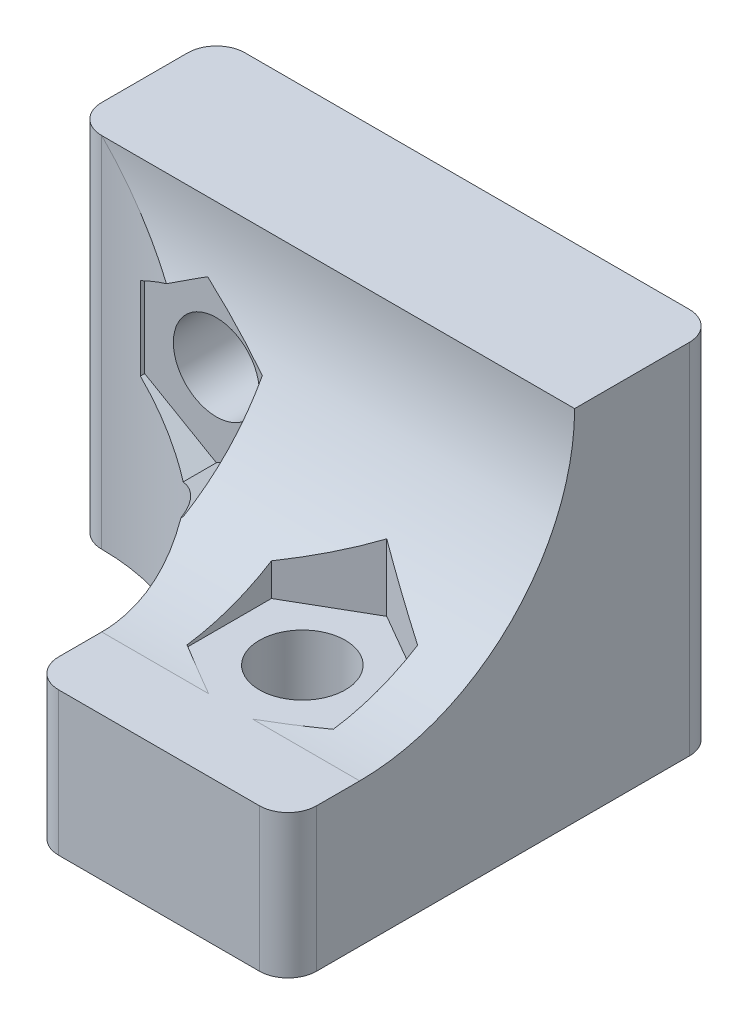
ISO-10303-21;
HEADER;
FILE_DESCRIPTION(('STEP AP214'),'2;1');
FILE_NAME('part.step','',(''),(''),'','','');
FILE_SCHEMA(('AUTOMOTIVE_DESIGN { 1 0 10303 214 1 1 1 1 }'));
ENDSEC;
DATA;
#1=APPLICATION_CONTEXT('core data for automotive mechanical design processes');
#2=APPLICATION_PROTOCOL_DEFINITION('international standard','automotive_design',2000,#1);
#3=PRODUCT_CONTEXT('',#1,'mechanical');
#4=PRODUCT('Part','Part','',(#3));
#5=PRODUCT_RELATED_PRODUCT_CATEGORY('part','',(#4));
#6=PRODUCT_DEFINITION_FORMATION('','',#4);
#7=PRODUCT_DEFINITION_CONTEXT('part definition',#1,'design');
#8=PRODUCT_DEFINITION('design','',#6,#7);
#9=PRODUCT_DEFINITION_SHAPE('','',#8);
#10=(LENGTH_UNIT() NAMED_UNIT(*) SI_UNIT(.MILLI.,.METRE.));
#11=(NAMED_UNIT(*) PLANE_ANGLE_UNIT() SI_UNIT($,.RADIAN.));
#12=(NAMED_UNIT(*) SI_UNIT($,.STERADIAN.) SOLID_ANGLE_UNIT());
#13=UNCERTAINTY_MEASURE_WITH_UNIT(LENGTH_MEASURE(1.E-05),#10,'distance_accuracy_value','');
#14=(GEOMETRIC_REPRESENTATION_CONTEXT(3) GLOBAL_UNCERTAINTY_ASSIGNED_CONTEXT((#13)) GLOBAL_UNIT_ASSIGNED_CONTEXT((#10,
#11,#12)) REPRESENTATION_CONTEXT('',''));
#15=CARTESIAN_POINT('',(0.,0.,0.));
#16=DIRECTION('',(0.,0.,1.));
#17=DIRECTION('',(1.,0.,0.));
#18=AXIS2_PLACEMENT_3D('',#15,#16,#17);
#19=CARTESIAN_POINT('',(17.5,12.5,10.));
#20=DIRECTION('',(-1.,0.,0.));
#21=DIRECTION('',(0.,0.,1.));
#22=AXIS2_PLACEMENT_3D('',#19,#20,#21);
#23=PLANE('',#22);
#24=DIRECTION('',(0.,0.,-1.));
#25=VECTOR('',#24,1.);
#26=CARTESIAN_POINT('',(17.5,-12.5,10.));
#27=LINE('',#26,#25);
#28=CARTESIAN_POINT('',(17.5,-12.5,28.));
#29=VERTEX_POINT('',#28);
#30=CARTESIAN_POINT('',(17.5,-12.5,2.));
#31=VERTEX_POINT('',#30);
#32=EDGE_CURVE('E384',#29,#31,#27,.T.);
#33=ORIENTED_EDGE('',*,*,#32,.T.);
#34=DIRECTION('',(0.,1.,0.));
#35=VECTOR('',#34,1.);
#36=CARTESIAN_POINT('',(17.5,12.5,2.));
#37=LINE('',#36,#35);
#38=CARTESIAN_POINT('',(17.5,12.5,2.));
#39=VERTEX_POINT('',#38);
#40=EDGE_CURVE('E435',#31,#39,#37,.T.);
#41=ORIENTED_EDGE('',*,*,#40,.T.);
#42=DIRECTION('',(0.,0.,-1.));
#43=VECTOR('',#42,1.);
#44=CARTESIAN_POINT('',(17.5,12.5,10.));
#45=LINE('',#44,#43);
#46=CARTESIAN_POINT('',(17.5,12.5,10.));
#47=VERTEX_POINT('',#46);
#48=EDGE_CURVE('E403',#47,#39,#45,.T.);
#49=ORIENTED_EDGE('',*,*,#48,.F.);
#50=CARTESIAN_POINT('',(17.5,12.5,25.));
#51=DIRECTION('',(-1.,0.,0.));
#52=DIRECTION('',(0.,0.,1.));
#53=AXIS2_PLACEMENT_3D('',#50,#51,#52);
#54=CIRCLE('',#53,15.);
#55=CARTESIAN_POINT('',(17.5,-2.5,25.));
#56=VERTEX_POINT('',#55);
#57=EDGE_CURVE('E424',#47,#56,#54,.T.);
#58=ORIENTED_EDGE('',*,*,#57,.T.);
#59=DIRECTION('',(0.,0.,-1.));
#60=VECTOR('',#59,1.);
#61=CARTESIAN_POINT('',(17.5,-2.5,30.));
#62=LINE('',#61,#60);
#63=CARTESIAN_POINT('',(17.5,-2.5,28.));
#64=VERTEX_POINT('',#63);
#65=EDGE_CURVE('E372',#64,#56,#62,.T.);
#66=ORIENTED_EDGE('',*,*,#65,.F.);
#67=DIRECTION('',(0.,1.,0.));
#68=VECTOR('',#67,1.);
#69=CARTESIAN_POINT('',(17.5,-12.5,28.));
#70=LINE('',#69,#68);
#71=EDGE_CURVE('E428',#64,#29,#70,.F.);
#72=ORIENTED_EDGE('',*,*,#71,.T.);
#73=EDGE_LOOP('',(#33,#41,#49,#58,#66,#72));
#74=FACE_BOUND('',#73,.T.);
#75=ADVANCED_FACE('F80',(#74),#23,.F.);
#76=CARTESIAN_POINT('',(-17.5,12.5,10.));
#77=DIRECTION('',(0.,-1.,0.));
#78=DIRECTION('',(0.,0.,-1.));
#79=AXIS2_PLACEMENT_3D('',#76,#77,#78);
#80=PLANE('',#79);
#81=ORIENTED_EDGE('',*,*,#48,.T.);
#82=CARTESIAN_POINT('',(15.5,12.5,2.));
#83=DIRECTION('',(0.,-1.,0.));
#84=DIRECTION('',(0.,0.,-1.));
#85=AXIS2_PLACEMENT_3D('',#82,#83,#84);
#86=CIRCLE('',#85,2.);
#87=CARTESIAN_POINT('',(15.5,12.5,0.));
#88=VERTEX_POINT('',#87);
#89=EDGE_CURVE('E446',#39,#88,#86,.F.);
#90=ORIENTED_EDGE('',*,*,#89,.T.);
#91=DIRECTION('',(-1.,0.,0.));
#92=VECTOR('',#91,1.);
#93=CARTESIAN_POINT('',(-17.5,12.5,0.));
#94=LINE('',#93,#92);
#95=CARTESIAN_POINT('',(-15.5,12.5,0.));
#96=VERTEX_POINT('',#95);
#97=EDGE_CURVE('E379',#88,#96,#94,.T.);
#98=ORIENTED_EDGE('',*,*,#97,.T.);
#99=CARTESIAN_POINT('',(-15.5,12.5,2.));
#100=DIRECTION('',(0.,-1.,0.));
#101=DIRECTION('',(0.,0.,-1.));
#102=AXIS2_PLACEMENT_3D('',#99,#100,#101);
#103=CIRCLE('',#102,2.);
#104=CARTESIAN_POINT('',(-17.5,12.5,2.));
#105=VERTEX_POINT('',#104);
#106=EDGE_CURVE('E443',#96,#105,#103,.F.);
#107=ORIENTED_EDGE('',*,*,#106,.T.);
#108=DIRECTION('',(0.,0.,-1.));
#109=VECTOR('',#108,1.);
#110=CARTESIAN_POINT('',(-17.5,12.5,10.));
#111=LINE('',#110,#109);
#112=CARTESIAN_POINT('',(-17.5,12.5,8.));
#113=VERTEX_POINT('',#112);
#114=EDGE_CURVE('E399',#113,#105,#111,.T.);
#115=ORIENTED_EDGE('',*,*,#114,.F.);
#116=CARTESIAN_POINT('',(-15.5,12.5,8.));
#117=DIRECTION('',(0.,-1.,0.));
#118=DIRECTION('',(0.,0.,-1.));
#119=AXIS2_PLACEMENT_3D('',#116,#117,#118);
#120=CIRCLE('',#119,2.);
#121=CARTESIAN_POINT('',(-15.5,12.5,10.));
#122=VERTEX_POINT('',#121);
#123=EDGE_CURVE('E439',#113,#122,#120,.F.);
#124=ORIENTED_EDGE('',*,*,#123,.T.);
#125=DIRECTION('',(-1.,0.,0.));
#126=VECTOR('',#125,1.);
#127=CARTESIAN_POINT('',(-17.5,12.5,10.));
#128=LINE('',#127,#126);
#129=EDGE_CURVE('E380',#47,#122,#128,.T.);
#130=ORIENTED_EDGE('',*,*,#129,.F.);
#131=EDGE_LOOP('',(#81,#90,#98,#107,#115,#124,#130));
#132=FACE_BOUND('',#131,.T.);
#133=ADVANCED_FACE('F556',(#132),#80,.F.);
#134=CARTESIAN_POINT('',(-17.5,12.5,10.));
#135=DIRECTION('',(1.,0.,0.));
#136=DIRECTION('',(0.,1.,0.));
#137=AXIS2_PLACEMENT_3D('',#134,#135,#136);
#138=PLANE('',#137);
#139=ORIENTED_EDGE('',*,*,#114,.T.);
#140=DIRECTION('',(0.,-1.,0.));
#141=VECTOR('',#140,1.);
#142=CARTESIAN_POINT('',(-17.5,12.5,2.));
#143=LINE('',#142,#141);
#144=CARTESIAN_POINT('',(-17.5,-12.5,2.));
#145=VERTEX_POINT('',#144);
#146=EDGE_CURVE('E473',#105,#145,#143,.T.);
#147=ORIENTED_EDGE('',*,*,#146,.T.);
#148=DIRECTION('',(0.,0.,-1.));
#149=VECTOR('',#148,1.);
#150=CARTESIAN_POINT('',(-17.5,-12.5,10.));
#151=LINE('',#150,#149);
#152=CARTESIAN_POINT('',(-17.5,-12.5,8.));
#153=VERTEX_POINT('',#152);
#154=EDGE_CURVE('E395',#153,#145,#151,.T.);
#155=ORIENTED_EDGE('',*,*,#154,.F.);
#156=DIRECTION('',(0.,-1.,0.));
#157=VECTOR('',#156,1.);
#158=CARTESIAN_POINT('',(-17.5,12.5,8.));
#159=LINE('',#158,#157);
#160=EDGE_CURVE('E470',#153,#113,#159,.F.);
#161=ORIENTED_EDGE('',*,*,#160,.T.);
#162=EDGE_LOOP('',(#139,#147,#155,#161));
#163=FACE_BOUND('',#162,.T.);
#164=ADVANCED_FACE('F603',(#163),#138,.F.);
#165=CARTESIAN_POINT('',(-17.5,-12.5,10.));
#166=DIRECTION('',(0.,1.,0.));
#167=DIRECTION('',(0.,0.,1.));
#168=AXIS2_PLACEMENT_3D('',#165,#166,#167);
#169=PLANE('',#168);
#170=CARTESIAN_POINT('',(8.50000000000001,-12.5,20.));
#171=DIRECTION('',(0.,1.,0.));
#172=DIRECTION('',(-1.,0.,0.));
#173=AXIS2_PLACEMENT_3D('',#170,#171,#172);
#174=CIRCLE('',#173,3.);
#175=CARTESIAN_POINT('',(5.50000000000001,-12.5,20.));
#176=VERTEX_POINT('',#175);
#177=EDGE_CURVE('E352',#176,#176,#174,.T.);
#178=ORIENTED_EDGE('',*,*,#177,.T.);
#179=EDGE_LOOP('',(#178));
#180=FACE_BOUND('',#179,.T.);
#181=DIRECTION('',(1.,0.,0.));
#182=VECTOR('',#181,1.);
#183=CARTESIAN_POINT('',(-17.5,-12.5,0.));
#184=LINE('',#183,#182);
#185=CARTESIAN_POINT('',(-15.5,-12.5,0.));
#186=VERTEX_POINT('',#185);
#187=CARTESIAN_POINT('',(15.5,-12.5,0.));
#188=VERTEX_POINT('',#187);
#189=EDGE_CURVE('E385',#186,#188,#184,.T.);
#190=ORIENTED_EDGE('',*,*,#189,.T.);
#191=CARTESIAN_POINT('',(15.5,-12.5,2.));
#192=DIRECTION('',(0.,1.,0.));
#193=DIRECTION('',(0.,0.,1.));
#194=AXIS2_PLACEMENT_3D('',#191,#192,#193);
#195=CIRCLE('',#194,2.);
#196=EDGE_CURVE('E467',#188,#31,#195,.F.);
#197=ORIENTED_EDGE('',*,*,#196,.T.);
#198=ORIENTED_EDGE('',*,*,#32,.F.);
#199=CARTESIAN_POINT('',(15.5,-12.5,28.));
#200=DIRECTION('',(0.,1.,0.));
#201=DIRECTION('',(0.,0.,1.));
#202=AXIS2_PLACEMENT_3D('',#199,#200,#201);
#203=CIRCLE('',#202,2.);
#204=CARTESIAN_POINT('',(15.5,-12.5,30.));
#205=VERTEX_POINT('',#204);
#206=EDGE_CURVE('E455',#29,#205,#203,.F.);
#207=ORIENTED_EDGE('',*,*,#206,.T.);
#208=DIRECTION('',(1.,0.,0.));
#209=VECTOR('',#208,1.);
#210=CARTESIAN_POINT('',(17.5,-12.5,30.));
#211=LINE('',#210,#209);
#212=CARTESIAN_POINT('',(1.5,-12.5,30.));
#213=VERTEX_POINT('',#212);
#214=EDGE_CURVE('E361',#213,#205,#211,.T.);
#215=ORIENTED_EDGE('',*,*,#214,.F.);
#216=CARTESIAN_POINT('',(1.5,-12.5,28.));
#217=DIRECTION('',(0.,1.,0.));
#218=DIRECTION('',(0.,0.,1.));
#219=AXIS2_PLACEMENT_3D('',#216,#217,#218);
#220=CIRCLE('',#219,2.);
#221=CARTESIAN_POINT('',(-0.499999999999997,-12.5,28.));
#222=VERTEX_POINT('',#221);
#223=EDGE_CURVE('E458',#213,#222,#220,.F.);
#224=ORIENTED_EDGE('',*,*,#223,.T.);
#225=DIRECTION('',(0.,0.,-1.));
#226=VECTOR('',#225,1.);
#227=CARTESIAN_POINT('',(-0.499999999999997,-12.5,30.));
#228=LINE('',#227,#226);
#229=CARTESIAN_POINT('',(-0.499999999999997,-12.5,25.));
#230=VERTEX_POINT('',#229);
#231=EDGE_CURVE('E365',#222,#230,#228,.T.);
#232=ORIENTED_EDGE('',*,*,#231,.T.);
#233=CARTESIAN_POINT('',(-15.5,-12.5,25.));
#234=DIRECTION('',(0.,1.,0.));
#235=DIRECTION('',(0.,0.,1.));
#236=AXIS2_PLACEMENT_3D('',#233,#234,#235);
#237=CIRCLE('',#236,15.);
#238=CARTESIAN_POINT('',(-15.5,-12.5,10.));
#239=VERTEX_POINT('',#238);
#240=EDGE_CURVE('E420',#230,#239,#237,.T.);
#241=ORIENTED_EDGE('',*,*,#240,.T.);
#242=CARTESIAN_POINT('',(-15.5,-12.5,8.));
#243=DIRECTION('',(0.,1.,0.));
#244=DIRECTION('',(0.,0.,1.));
#245=AXIS2_PLACEMENT_3D('',#242,#243,#244);
#246=CIRCLE('',#245,2.);
#247=EDGE_CURVE('E461',#239,#153,#246,.F.);
#248=ORIENTED_EDGE('',*,*,#247,.T.);
#249=ORIENTED_EDGE('',*,*,#154,.T.);
#250=CARTESIAN_POINT('',(-15.5,-12.5,2.));
#251=DIRECTION('',(0.,1.,0.));
#252=DIRECTION('',(0.,0.,1.));
#253=AXIS2_PLACEMENT_3D('',#250,#251,#252);
#254=CIRCLE('',#253,2.);
#255=EDGE_CURVE('E464',#145,#186,#254,.F.);
#256=ORIENTED_EDGE('',*,*,#255,.T.);
#257=EDGE_LOOP('',(#190,#197,#198,#207,#215,#224,#232,#241,#248,#249,#256));
#258=FACE_BOUND('',#257,.T.);
#259=ADVANCED_FACE('F565',(#180,#258),#169,.F.);
#260=CARTESIAN_POINT('',(0.,0.,0.));
#261=DIRECTION('',(0.,0.,1.));
#262=DIRECTION('',(1.,0.,0.));
#263=AXIS2_PLACEMENT_3D('',#260,#261,#262);
#264=PLANE('',#263);
#265=CARTESIAN_POINT('',(-7.5,2.5,0.));
#266=DIRECTION('',(0.,0.,1.));
#267=DIRECTION('',(1.,0.,0.));
#268=AXIS2_PLACEMENT_3D('',#265,#266,#267);
#269=CIRCLE('',#268,3.);
#270=CARTESIAN_POINT('',(-4.5,2.5,0.));
#271=VERTEX_POINT('',#270);
#272=EDGE_CURVE('E375',#271,#271,#269,.T.);
#273=ORIENTED_EDGE('',*,*,#272,.T.);
#274=EDGE_LOOP('',(#273));
#275=FACE_BOUND('',#274,.T.);
#276=ORIENTED_EDGE('',*,*,#97,.F.);
#277=DIRECTION('',(0.,1.,0.));
#278=VECTOR('',#277,1.);
#279=CARTESIAN_POINT('',(15.5,0.,0.));
#280=LINE('',#279,#278);
#281=EDGE_CURVE('E452',#88,#188,#280,.F.);
#282=ORIENTED_EDGE('',*,*,#281,.T.);
#283=ORIENTED_EDGE('',*,*,#189,.F.);
#284=DIRECTION('',(0.,-1.,0.));
#285=VECTOR('',#284,1.);
#286=CARTESIAN_POINT('',(-15.5,0.,0.));
#287=LINE('',#286,#285);
#288=EDGE_CURVE('E449',#186,#96,#287,.F.);
#289=ORIENTED_EDGE('',*,*,#288,.T.);
#290=EDGE_LOOP('',(#276,#282,#283,#289));
#291=FACE_BOUND('',#290,.T.);
#292=ADVANCED_FACE('F673',(#275,#291),#264,.F.);
#293=CARTESIAN_POINT('',(-7.5,2.5,0.));
#294=DIRECTION('',(0.,0.,1.));
#295=DIRECTION('',(1.,0.,0.));
#296=AXIS2_PLACEMENT_3D('',#293,#294,#295);
#297=CYLINDRICAL_SURFACE('',#296,3.);
#298=CARTESIAN_POINT('',(-7.5,2.5,10.));
#299=DIRECTION('',(0.,0.,-1.));
#300=DIRECTION('',(-1.,0.,0.));
#301=AXIS2_PLACEMENT_3D('',#298,#299,#300);
#302=CIRCLE('',#301,3.);
#303=CARTESIAN_POINT('',(-10.5,2.5,10.));
#304=VERTEX_POINT('',#303);
#305=EDGE_CURVE('E351',#304,#304,#302,.F.);
#306=ORIENTED_EDGE('',*,*,#305,.T.);
#307=EDGE_LOOP('',(#306));
#308=FACE_BOUND('',#307,.T.);
#309=ORIENTED_EDGE('',*,*,#272,.F.);
#310=EDGE_LOOP('',(#309));
#311=FACE_BOUND('',#310,.T.);
#312=ADVANCED_FACE('F671',(#308,#311),#297,.F.);
#313=CARTESIAN_POINT('',(17.5,-2.5,30.));
#314=DIRECTION('',(0.,-1.,0.));
#315=DIRECTION('',(1.,0.,0.));
#316=AXIS2_PLACEMENT_3D('',#313,#314,#315);
#317=PLANE('',#316);
#318=DIRECTION('',(-0.866025403784439,0.,-0.5));
#319=VECTOR('',#318,1.);
#320=CARTESIAN_POINT('',(8.50000000000001,-2.5,25.8889727457342));
#321=LINE('',#320,#319);
#322=CARTESIAN_POINT('',(6.96025403784431,-2.5,25.));
#323=VERTEX_POINT('',#322);
#324=CARTESIAN_POINT('',(3.39999999999996,-2.5,22.9444863728671));
#325=VERTEX_POINT('',#324);
#326=EDGE_CURVE('E96',#323,#325,#321,.T.);
#327=ORIENTED_EDGE('',*,*,#326,.F.);
#328=DIRECTION('',(-1.,0.,0.));
#329=VECTOR('',#328,1.);
#330=CARTESIAN_POINT('',(17.5,-2.5,25.));
#331=LINE('',#330,#329);
#332=CARTESIAN_POINT('',(-0.499999999999997,-2.5,25.));
#333=VERTEX_POINT('',#332);
#334=EDGE_CURVE('E415',#323,#333,#331,.T.);
#335=ORIENTED_EDGE('',*,*,#334,.T.);
#336=DIRECTION('',(0.,0.,-1.));
#337=VECTOR('',#336,1.);
#338=CARTESIAN_POINT('',(-0.499999999999997,-2.5,30.));
#339=LINE('',#338,#337);
#340=CARTESIAN_POINT('',(-0.499999999999997,-2.5,28.));
#341=VERTEX_POINT('',#340);
#342=EDGE_CURVE('E368',#341,#333,#339,.T.);
#343=ORIENTED_EDGE('',*,*,#342,.F.);
#344=CARTESIAN_POINT('',(1.5,-2.5,28.));
#345=DIRECTION('',(0.,-1.,0.));
#346=DIRECTION('',(1.,0.,0.));
#347=AXIS2_PLACEMENT_3D('',#344,#345,#346);
#348=CIRCLE('',#347,2.);
#349=CARTESIAN_POINT('',(1.5,-2.5,30.));
#350=VERTEX_POINT('',#349);
#351=EDGE_CURVE('E491',#341,#350,#348,.F.);
#352=ORIENTED_EDGE('',*,*,#351,.T.);
#353=DIRECTION('',(-1.,0.,0.));
#354=VECTOR('',#353,1.);
#355=CARTESIAN_POINT('',(17.5,-2.5,30.));
#356=LINE('',#355,#354);
#357=CARTESIAN_POINT('',(15.5,-2.5,30.));
#358=VERTEX_POINT('',#357);
#359=EDGE_CURVE('E356',#358,#350,#356,.T.);
#360=ORIENTED_EDGE('',*,*,#359,.F.);
#361=CARTESIAN_POINT('',(15.5,-2.5,28.));
#362=DIRECTION('',(0.,-1.,0.));
#363=DIRECTION('',(1.,0.,0.));
#364=AXIS2_PLACEMENT_3D('',#361,#362,#363);
#365=CIRCLE('',#364,2.);
#366=EDGE_CURVE('E488',#358,#64,#365,.F.);
#367=ORIENTED_EDGE('',*,*,#366,.T.);
#368=ORIENTED_EDGE('',*,*,#65,.T.);
#369=CARTESIAN_POINT('',(10.0397459621557,-2.5,25.));
#370=VERTEX_POINT('',#369);
#371=EDGE_CURVE('E416',#56,#370,#331,.T.);
#372=ORIENTED_EDGE('',*,*,#371,.T.);
#373=DIRECTION('',(-0.866025403784439,0.,0.5));
#374=VECTOR('',#373,1.);
#375=CARTESIAN_POINT('',(13.6000000000001,-2.5,22.9444863728671));
#376=LINE('',#375,#374);
#377=CARTESIAN_POINT('',(13.6000000000001,-2.5,22.9444863728671));
#378=VERTEX_POINT('',#377);
#379=EDGE_CURVE('E282',#378,#370,#376,.T.);
#380=ORIENTED_EDGE('',*,*,#379,.F.);
#381=DIRECTION('',(0.,0.,1.));
#382=VECTOR('',#381,1.);
#383=CARTESIAN_POINT('',(13.6000000000001,-2.5,17.0555136271329));
#384=LINE('',#383,#382);
#385=CARTESIAN_POINT('',(13.6000000000001,-2.5,17.0555136271329));
#386=VERTEX_POINT('',#385);
#387=EDGE_CURVE('E271',#386,#378,#384,.T.);
#388=ORIENTED_EDGE('',*,*,#387,.F.);
#389=DIRECTION('',(0.866025403784439,0.,0.5));
#390=VECTOR('',#389,1.);
#391=CARTESIAN_POINT('',(8.50000000000001,-2.5,14.1110272542658));
#392=LINE('',#391,#390);
#393=CARTESIAN_POINT('',(8.50000000000001,-2.5,14.1110272542658));
#394=VERTEX_POINT('',#393);
#395=EDGE_CURVE('E253',#394,#386,#392,.T.);
#396=ORIENTED_EDGE('',*,*,#395,.F.);
#397=DIRECTION('',(0.866025403784439,0.,-0.5));
#398=VECTOR('',#397,1.);
#399=CARTESIAN_POINT('',(3.39999999999996,-2.5,17.0555136271329));
#400=LINE('',#399,#398);
#401=CARTESIAN_POINT('',(3.39999999999996,-2.5,17.0555136271329));
#402=VERTEX_POINT('',#401);
#403=EDGE_CURVE('E267',#402,#394,#400,.T.);
#404=ORIENTED_EDGE('',*,*,#403,.F.);
#405=DIRECTION('',(0.,0.,-1.));
#406=VECTOR('',#405,1.);
#407=CARTESIAN_POINT('',(3.39999999999996,-2.5,22.9444863728671));
#408=LINE('',#407,#406);
#409=EDGE_CURVE('E261',#325,#402,#408,.T.);
#410=ORIENTED_EDGE('',*,*,#409,.F.);
#411=EDGE_LOOP('',(#327,#335,#343,#352,#360,#367,#368,#372,#380,#388,#396,#404,#410));
#412=FACE_BOUND('',#411,.T.);
#413=CARTESIAN_POINT('',(8.5,-2.5,20.));
#414=DIRECTION('',(0.,-1.,0.));
#415=DIRECTION('',(0.,0.,-1.));
#416=AXIS2_PLACEMENT_3D('',#413,#414,#415);
#417=CIRCLE('',#416,3.);
#418=CARTESIAN_POINT('',(8.5,-2.5,17.));
#419=VERTEX_POINT('',#418);
#420=EDGE_CURVE('E291',#419,#419,#417,.F.);
#421=ORIENTED_EDGE('',*,*,#420,.F.);
#422=EDGE_LOOP('',(#421));
#423=FACE_BOUND('',#422,.T.);
#424=ADVANCED_FACE('F265',(#412,#423),#317,.F.);
#425=CARTESIAN_POINT('',(-0.499999999999997,-12.5,30.));
#426=DIRECTION('',(1.,0.,0.));
#427=DIRECTION('',(0.,0.,-1.));
#428=AXIS2_PLACEMENT_3D('',#425,#426,#427);
#429=PLANE('',#428);
#430=ORIENTED_EDGE('',*,*,#231,.F.);
#431=DIRECTION('',(0.,-1.,0.));
#432=VECTOR('',#431,1.);
#433=CARTESIAN_POINT('',(-0.499999999999997,-2.5,28.));
#434=LINE('',#433,#432);
#435=EDGE_CURVE('E485',#222,#341,#434,.F.);
#436=ORIENTED_EDGE('',*,*,#435,.T.);
#437=ORIENTED_EDGE('',*,*,#342,.T.);
#438=DIRECTION('',(0.,-1.,0.));
#439=VECTOR('',#438,1.);
#440=CARTESIAN_POINT('',(-0.499999999999997,-12.5,25.));
#441=LINE('',#440,#439);
#442=EDGE_CURVE('E407',#333,#230,#441,.T.);
#443=ORIENTED_EDGE('',*,*,#442,.T.);
#444=EDGE_LOOP('',(#430,#436,#437,#443));
#445=FACE_BOUND('',#444,.T.);
#446=ADVANCED_FACE('F568',(#445),#429,.F.);
#447=CARTESIAN_POINT('',(0.,0.,30.));
#448=DIRECTION('',(0.,0.,1.));
#449=DIRECTION('',(1.,0.,0.));
#450=AXIS2_PLACEMENT_3D('',#447,#448,#449);
#451=PLANE('',#450);
#452=ORIENTED_EDGE('',*,*,#359,.T.);
#453=DIRECTION('',(0.,-1.,0.));
#454=VECTOR('',#453,1.);
#455=CARTESIAN_POINT('',(1.5,-12.5,30.));
#456=LINE('',#455,#454);
#457=EDGE_CURVE('E481',#350,#213,#456,.T.);
#458=ORIENTED_EDGE('',*,*,#457,.T.);
#459=ORIENTED_EDGE('',*,*,#214,.T.);
#460=DIRECTION('',(0.,1.,0.));
#461=VECTOR('',#460,1.);
#462=CARTESIAN_POINT('',(15.5,-2.5,30.));
#463=LINE('',#462,#461);
#464=EDGE_CURVE('E477',#205,#358,#463,.T.);
#465=ORIENTED_EDGE('',*,*,#464,.T.);
#466=EDGE_LOOP('',(#452,#458,#459,#465));
#467=FACE_BOUND('',#466,.T.);
#468=ADVANCED_FACE('F577',(#467),#451,.T.);
#469=CARTESIAN_POINT('',(8.50000000000001,-12.5,20.));
#470=DIRECTION('',(0.,1.,0.));
#471=DIRECTION('',(-1.,0.,0.));
#472=AXIS2_PLACEMENT_3D('',#469,#470,#471);
#473=CYLINDRICAL_SURFACE('',#472,3.);
#474=ORIENTED_EDGE('',*,*,#420,.T.);
#475=EDGE_LOOP('',(#474));
#476=FACE_BOUND('',#475,.T.);
#477=ORIENTED_EDGE('',*,*,#177,.F.);
#478=EDGE_LOOP('',(#477));
#479=FACE_BOUND('',#478,.T.);
#480=ADVANCED_FACE('F612',(#476,#479),#473,.F.);
#481=CARTESIAN_POINT('',(17.5,12.5,25.));
#482=DIRECTION('',(-1.,0.,0.));
#483=DIRECTION('',(0.,-1.,0.));
#484=AXIS2_PLACEMENT_3D('',#481,#482,#483);
#485=CYLINDRICAL_SURFACE('',#484,15.);
#486=ORIENTED_EDGE('',*,*,#334,.F.);
#487=CARTESIAN_POINT('',(6.96025403784431,12.5,25.));
#488=DIRECTION('',(-0.5,0.,0.866025403784439));
#489=DIRECTION('',(-0.866025403784439,0.,-0.5));
#490=AXIS2_PLACEMENT_3D('',#487,#488,#489);
#491=ELLIPSE('',#490,30.,15.);
#492=CARTESIAN_POINT('',(3.39999999999996,-2.3584946656339,22.9444863728671));
#493=VERTEX_POINT('',#492);
#494=EDGE_CURVE('E12',#323,#493,#491,.F.);
#495=ORIENTED_EDGE('',*,*,#494,.T.);
#496=CARTESIAN_POINT('',(3.39999999999996,12.5,25.));
#497=DIRECTION('',(-1.,0.,0.));
#498=DIRECTION('',(0.,0.,1.));
#499=AXIS2_PLACEMENT_3D('',#496,#497,#498);
#500=CIRCLE('',#499,15.);
#501=CARTESIAN_POINT('',(3.39999999999996,-0.223408987819607,17.0555136271329));
#502=VERTEX_POINT('',#501);
#503=EDGE_CURVE('E89',#493,#502,#500,.F.);
#504=ORIENTED_EDGE('',*,*,#503,.T.);
#505=CARTESIAN_POINT('',(-10.3602540378445,12.5,25.));
#506=DIRECTION('',(-0.5,0.,-0.866025403784438));
#507=DIRECTION('',(-0.866025403784439,0.,0.5));
#508=AXIS2_PLACEMENT_3D('',#505,#506,#507);
#509=ELLIPSE('',#508,30.,15.);
#510=CARTESIAN_POINT('',(8.50000000000001,2.18349513921226,14.1110272542658));
#511=VERTEX_POINT('',#510);
#512=EDGE_CURVE('E531',#502,#511,#509,.F.);
#513=ORIENTED_EDGE('',*,*,#512,.T.);
#514=CARTESIAN_POINT('',(27.3602540378445,12.5,25.));
#515=DIRECTION('',(0.5,0.,-0.866025403784439));
#516=DIRECTION('',(-0.866025403784439,0.,-0.5));
#517=AXIS2_PLACEMENT_3D('',#514,#515,#516);
#518=ELLIPSE('',#517,30.,15.);
#519=CARTESIAN_POINT('',(13.6000000000001,-0.223408987819603,17.0555136271329));
#520=VERTEX_POINT('',#519);
#521=EDGE_CURVE('E255',#511,#520,#518,.F.);
#522=ORIENTED_EDGE('',*,*,#521,.T.);
#523=CARTESIAN_POINT('',(13.6000000000001,12.5,25.));
#524=DIRECTION('',(1.,0.,0.));
#525=DIRECTION('',(0.,0.,-1.));
#526=AXIS2_PLACEMENT_3D('',#523,#524,#525);
#527=CIRCLE('',#526,15.);
#528=CARTESIAN_POINT('',(13.6000000000001,-2.3584946656339,22.9444863728671));
#529=VERTEX_POINT('',#528);
#530=EDGE_CURVE('E523',#520,#529,#527,.F.);
#531=ORIENTED_EDGE('',*,*,#530,.T.);
#532=CARTESIAN_POINT('',(10.0397459621557,12.5,25.));
#533=DIRECTION('',(0.5,0.,0.866025403784438));
#534=DIRECTION('',(-0.866025403784439,0.,0.5));
#535=AXIS2_PLACEMENT_3D('',#532,#533,#534);
#536=ELLIPSE('',#535,30.,15.);
#537=EDGE_CURVE('E527',#529,#370,#536,.F.);
#538=ORIENTED_EDGE('',*,*,#537,.T.);
#539=ORIENTED_EDGE('',*,*,#371,.F.);
#540=ORIENTED_EDGE('',*,*,#57,.F.);
#541=ORIENTED_EDGE('',*,*,#129,.T.);
#542=CARTESIAN_POINT('',(-15.5,12.5,25.));
#543=DIRECTION('',(-0.707106781186547,-0.707106781186548,0.));
#544=DIRECTION('',(-0.707106781186548,0.707106781186547,0.));
#545=AXIS2_PLACEMENT_3D('',#542,#543,#544);
#546=ELLIPSE('',#545,21.2132034355964,15.);
#547=CARTESIAN_POINT('',(-9.89230484541329,6.89230484541329,11.0876402054423));
#548=VERTEX_POINT('',#547);
#549=EDGE_CURVE('E432',#548,#122,#546,.F.);
#550=ORIENTED_EDGE('',*,*,#549,.F.);
#551=CARTESIAN_POINT('',(-0.179491924311315,12.5,25.));
#552=DIRECTION('',(-0.5,0.866025403784439,0.));
#553=DIRECTION('',(-0.866025403784439,-0.5,0.));
#554=AXIS2_PLACEMENT_3D('',#551,#552,#553);
#555=ELLIPSE('',#554,30.,15.);
#556=CARTESIAN_POINT('',(-7.5,8.27350269189631,10.6077548483709));
#557=VERTEX_POINT('',#556);
#558=EDGE_CURVE('E347',#548,#557,#555,.F.);
#559=ORIENTED_EDGE('',*,*,#558,.T.);
#560=CARTESIAN_POINT('',(-14.8205080756887,12.5,25.));
#561=DIRECTION('',(0.5,0.866025403784438,0.));
#562=DIRECTION('',(-0.866025403784439,0.5,0.));
#563=AXIS2_PLACEMENT_3D('',#560,#561,#562);
#564=ELLIPSE('',#563,30.,15.);
#565=CARTESIAN_POINT('',(-2.49999999999995,5.38675134594815,11.7938766632433));
#566=VERTEX_POINT('',#565);
#567=EDGE_CURVE('E514',#557,#566,#564,.F.);
#568=ORIENTED_EDGE('',*,*,#567,.T.);
#569=CARTESIAN_POINT('',(-2.49999999999995,12.5,25.));
#570=DIRECTION('',(1.,0.,0.));
#571=DIRECTION('',(0.,0.,-1.));
#572=AXIS2_PLACEMENT_3D('',#569,#570,#571);
#573=CIRCLE('',#572,15.);
#574=CARTESIAN_POINT('',(-2.49999999999995,-0.386751345948155,17.3233054152387));
#575=VERTEX_POINT('',#574);
#576=EDGE_CURVE('E510',#566,#575,#573,.F.);
#577=ORIENTED_EDGE('',*,*,#576,.T.);
#578=CARTESIAN_POINT('',(19.8205080756889,12.5,25.));
#579=DIRECTION('',(0.5,-0.866025403784439,0.));
#580=DIRECTION('',(-0.866025403784439,-0.5,0.));
#581=AXIS2_PLACEMENT_3D('',#578,#579,#580);
#582=ELLIPSE('',#581,30.,15.);
#583=CARTESIAN_POINT('',(-2.57179676972446,-0.428203230275543,17.3933212742556));
#584=VERTEX_POINT('',#583);
#585=EDGE_CURVE('E330',#575,#584,#582,.F.);
#586=ORIENTED_EDGE('',*,*,#585,.T.);
#587=EDGE_CURVE('E357',#333,#584,#546,.F.);
#588=ORIENTED_EDGE('',*,*,#587,.F.);
#589=EDGE_LOOP('',(#486,#495,#504,#513,#522,#531,#538,#539,#540,#541,#550,#559,#568,#577,#586,#588));
#590=FACE_BOUND('',#589,.T.);
#591=ADVANCED_FACE('F537',(#590),#485,.F.);
#592=CARTESIAN_POINT('',(-15.5,-12.5,25.));
#593=DIRECTION('',(0.,-1.,0.));
#594=DIRECTION('',(0.,0.,-1.));
#595=AXIS2_PLACEMENT_3D('',#592,#593,#594);
#596=CYLINDRICAL_SURFACE('',#595,15.);
#597=DIRECTION('',(0.,-1.,0.));
#598=VECTOR('',#597,1.);
#599=CARTESIAN_POINT('',(-12.5,-12.5,10.3030615433009));
#600=LINE('',#599,#598);
#601=CARTESIAN_POINT('',(-12.5,-0.386751345948157,10.3030615433009));
#602=VERTEX_POINT('',#601);
#603=CARTESIAN_POINT('',(-12.5,5.38675134594815,10.3030615433009));
#604=VERTEX_POINT('',#603);
#605=EDGE_CURVE('E502',#602,#604,#600,.F.);
#606=ORIENTED_EDGE('',*,*,#605,.T.);
#607=CARTESIAN_POINT('',(-15.5,3.6547005383793,25.));
#608=DIRECTION('',(-0.5,0.866025403784439,0.));
#609=DIRECTION('',(-0.866025403784439,-0.5,0.));
#610=AXIS2_PLACEMENT_3D('',#607,#608,#609);
#611=ELLIPSE('',#610,17.3205080756888,15.);
#612=EDGE_CURVE('E506',#604,#548,#611,.F.);
#613=ORIENTED_EDGE('',*,*,#612,.T.);
#614=ORIENTED_EDGE('',*,*,#549,.T.);
#615=DIRECTION('',(0.,-1.,0.));
#616=VECTOR('',#615,1.);
#617=CARTESIAN_POINT('',(-15.5,0.,10.));
#618=LINE('',#617,#616);
#619=EDGE_CURVE('E411',#239,#122,#618,.F.);
#620=ORIENTED_EDGE('',*,*,#619,.F.);
#621=ORIENTED_EDGE('',*,*,#240,.F.);
#622=ORIENTED_EDGE('',*,*,#442,.F.);
#623=ORIENTED_EDGE('',*,*,#587,.T.);
#624=CARTESIAN_POINT('',(-15.5,-7.89230484541331,25.));
#625=DIRECTION('',(0.5,-0.866025403784439,0.));
#626=DIRECTION('',(-0.866025403784439,-0.5,0.));
#627=AXIS2_PLACEMENT_3D('',#624,#625,#626);
#628=ELLIPSE('',#627,17.3205080756888,15.);
#629=CARTESIAN_POINT('',(-7.5,-3.27350269189631,12.3114224595505));
#630=VERTEX_POINT('',#629);
#631=EDGE_CURVE('E494',#584,#630,#628,.F.);
#632=ORIENTED_EDGE('',*,*,#631,.T.);
#633=CARTESIAN_POINT('',(-15.5,1.3452994616207,25.));
#634=DIRECTION('',(-0.5,-0.866025403784439,0.));
#635=DIRECTION('',(0.866025403784439,-0.5,0.));
#636=AXIS2_PLACEMENT_3D('',#633,#634,#635);
#637=ELLIPSE('',#636,17.3205080756888,15.);
#638=EDGE_CURVE('E498',#630,#602,#637,.F.);
#639=ORIENTED_EDGE('',*,*,#638,.T.);
#640=EDGE_LOOP('',(#606,#613,#614,#620,#621,#622,#623,#632,#639));
#641=FACE_BOUND('',#640,.T.);
#642=ADVANCED_FACE('F551',(#641),#596,.F.);
#643=CARTESIAN_POINT('',(15.5,12.5,2.));
#644=DIRECTION('',(0.,1.,0.));
#645=DIRECTION('',(0.,0.,1.));
#646=AXIS2_PLACEMENT_3D('',#643,#644,#645);
#647=CYLINDRICAL_SURFACE('',#646,2.);
#648=ORIENTED_EDGE('',*,*,#196,.F.);
#649=ORIENTED_EDGE('',*,*,#281,.F.);
#650=ORIENTED_EDGE('',*,*,#89,.F.);
#651=ORIENTED_EDGE('',*,*,#40,.F.);
#652=EDGE_LOOP('',(#648,#649,#650,#651));
#653=FACE_BOUND('',#652,.T.);
#654=ADVANCED_FACE('F609',(#653),#647,.T.);
#655=CARTESIAN_POINT('',(-15.5,12.5,2.));
#656=DIRECTION('',(0.,-1.,0.));
#657=DIRECTION('',(1.,0.,0.));
#658=AXIS2_PLACEMENT_3D('',#655,#656,#657);
#659=CYLINDRICAL_SURFACE('',#658,2.);
#660=ORIENTED_EDGE('',*,*,#106,.F.);
#661=ORIENTED_EDGE('',*,*,#288,.F.);
#662=ORIENTED_EDGE('',*,*,#255,.F.);
#663=ORIENTED_EDGE('',*,*,#146,.F.);
#664=EDGE_LOOP('',(#660,#661,#662,#663));
#665=FACE_BOUND('',#664,.T.);
#666=ADVANCED_FACE('F615',(#665),#659,.T.);
#667=CARTESIAN_POINT('',(-15.5,0.,8.));
#668=DIRECTION('',(0.,1.,0.));
#669=DIRECTION('',(-1.,0.,0.));
#670=AXIS2_PLACEMENT_3D('',#667,#668,#669);
#671=CYLINDRICAL_SURFACE('',#670,2.);
#672=ORIENTED_EDGE('',*,*,#123,.F.);
#673=ORIENTED_EDGE('',*,*,#160,.F.);
#674=ORIENTED_EDGE('',*,*,#247,.F.);
#675=ORIENTED_EDGE('',*,*,#619,.T.);
#676=EDGE_LOOP('',(#672,#673,#674,#675));
#677=FACE_BOUND('',#676,.T.);
#678=ADVANCED_FACE('F562',(#677),#671,.T.);
#679=CARTESIAN_POINT('',(1.5,0.,28.));
#680=DIRECTION('',(0.,1.,0.));
#681=DIRECTION('',(0.,0.,1.));
#682=AXIS2_PLACEMENT_3D('',#679,#680,#681);
#683=CYLINDRICAL_SURFACE('',#682,2.);
#684=ORIENTED_EDGE('',*,*,#351,.F.);
#685=ORIENTED_EDGE('',*,*,#435,.F.);
#686=ORIENTED_EDGE('',*,*,#223,.F.);
#687=ORIENTED_EDGE('',*,*,#457,.F.);
#688=EDGE_LOOP('',(#684,#685,#686,#687));
#689=FACE_BOUND('',#688,.T.);
#690=ADVANCED_FACE('F574',(#689),#683,.T.);
#691=CARTESIAN_POINT('',(15.5,0.,28.));
#692=DIRECTION('',(0.,-1.,0.));
#693=DIRECTION('',(0.,0.,-1.));
#694=AXIS2_PLACEMENT_3D('',#691,#692,#693);
#695=CYLINDRICAL_SURFACE('',#694,2.);
#696=ORIENTED_EDGE('',*,*,#206,.F.);
#697=ORIENTED_EDGE('',*,*,#71,.F.);
#698=ORIENTED_EDGE('',*,*,#366,.F.);
#699=ORIENTED_EDGE('',*,*,#464,.F.);
#700=EDGE_LOOP('',(#696,#697,#698,#699));
#701=FACE_BOUND('',#700,.T.);
#702=ADVANCED_FACE('F82',(#701),#695,.T.);
#703=CARTESIAN_POINT('',(0.,0.,10.));
#704=DIRECTION('',(0.,0.,-1.));
#705=DIRECTION('',(-1.,0.,0.));
#706=AXIS2_PLACEMENT_3D('',#703,#704,#705);
#707=PLANE('',#706);
#708=DIRECTION('',(0.,-1.,0.));
#709=VECTOR('',#708,1.);
#710=CARTESIAN_POINT('',(-2.49999999999995,0.,10.));
#711=LINE('',#710,#709);
#712=CARTESIAN_POINT('',(-2.49999999999995,5.38675134594815,10.));
#713=VERTEX_POINT('',#712);
#714=CARTESIAN_POINT('',(-2.49999999999995,-0.386751345948155,10.));
#715=VERTEX_POINT('',#714);
#716=EDGE_CURVE('E303',#713,#715,#711,.T.);
#717=ORIENTED_EDGE('',*,*,#716,.F.);
#718=DIRECTION('',(0.866025403784439,-0.5,0.));
#719=VECTOR('',#718,1.);
#720=CARTESIAN_POINT('',(1.70753175473057,2.95753175473058,10.));
#721=LINE('',#720,#719);
#722=CARTESIAN_POINT('',(-7.5,8.27350269189631,10.));
#723=VERTEX_POINT('',#722);
#724=EDGE_CURVE('E322',#723,#713,#721,.T.);
#725=ORIENTED_EDGE('',*,*,#724,.F.);
#726=DIRECTION('',(0.866025403784439,0.5,0.));
#727=VECTOR('',#726,1.);
#728=CARTESIAN_POINT('',(-5.45753175473057,9.45272228311388,10.));
#729=LINE('',#728,#727);
#730=CARTESIAN_POINT('',(-12.5,5.38675134594815,10.));
#731=VERTEX_POINT('',#730);
#732=EDGE_CURVE('E318',#731,#723,#729,.T.);
#733=ORIENTED_EDGE('',*,*,#732,.F.);
#734=DIRECTION('',(0.,1.,0.));
#735=VECTOR('',#734,1.);
#736=CARTESIAN_POINT('',(-12.5,0.,10.));
#737=LINE('',#736,#735);
#738=CARTESIAN_POINT('',(-12.5,-0.386751345948157,10.));
#739=VERTEX_POINT('',#738);
#740=EDGE_CURVE('E314',#739,#731,#737,.T.);
#741=ORIENTED_EDGE('',*,*,#740,.F.);
#742=DIRECTION('',(-0.866025403784439,0.5,0.));
#743=VECTOR('',#742,1.);
#744=CARTESIAN_POINT('',(-3.29246824526947,-5.70272228311388,10.));
#745=LINE('',#744,#743);
#746=CARTESIAN_POINT('',(-7.5,-3.27350269189631,10.));
#747=VERTEX_POINT('',#746);
#748=EDGE_CURVE('E310',#747,#739,#745,.T.);
#749=ORIENTED_EDGE('',*,*,#748,.F.);
#750=DIRECTION('',(-0.866025403784439,-0.5,0.));
#751=VECTOR('',#750,1.);
#752=CARTESIAN_POINT('',(-0.457531754730526,0.792468245269413,10.));
#753=LINE('',#752,#751);
#754=EDGE_CURVE('E307',#715,#747,#753,.T.);
#755=ORIENTED_EDGE('',*,*,#754,.F.);
#756=EDGE_LOOP('',(#717,#725,#733,#741,#749,#755));
#757=FACE_BOUND('',#756,.T.);
#758=ORIENTED_EDGE('',*,*,#305,.F.);
#759=EDGE_LOOP('',(#758));
#760=FACE_BOUND('',#759,.T.);
#761=ADVANCED_FACE('F625',(#757,#760),#707,.F.);
#762=CARTESIAN_POINT('',(1.70753175473057,2.95753175473058,30.));
#763=DIRECTION('',(0.5,0.866025403784438,0.));
#764=DIRECTION('',(-0.866025403784439,0.5,0.));
#765=AXIS2_PLACEMENT_3D('',#762,#763,#764);
#766=PLANE('',#765);
#767=DIRECTION('',(0.,0.,-1.));
#768=VECTOR('',#767,1.);
#769=CARTESIAN_POINT('',(-7.5,8.27350269189631,30.));
#770=LINE('',#769,#768);
#771=EDGE_CURVE('E331',#557,#723,#770,.T.);
#772=ORIENTED_EDGE('',*,*,#771,.T.);
#773=ORIENTED_EDGE('',*,*,#724,.T.);
#774=DIRECTION('',(0.,0.,-1.));
#775=VECTOR('',#774,1.);
#776=CARTESIAN_POINT('',(-2.49999999999995,5.38675134594815,30.));
#777=LINE('',#776,#775);
#778=EDGE_CURVE('E327',#566,#713,#777,.T.);
#779=ORIENTED_EDGE('',*,*,#778,.F.);
#780=ORIENTED_EDGE('',*,*,#567,.F.);
#781=EDGE_LOOP('',(#772,#773,#779,#780));
#782=FACE_BOUND('',#781,.T.);
#783=ADVANCED_FACE('F630',(#782),#766,.F.);
#784=CARTESIAN_POINT('',(-2.49999999999995,0.,30.));
#785=DIRECTION('',(1.,0.,0.));
#786=DIRECTION('',(0.,0.,-1.));
#787=AXIS2_PLACEMENT_3D('',#784,#785,#786);
#788=PLANE('',#787);
#789=ORIENTED_EDGE('',*,*,#778,.T.);
#790=ORIENTED_EDGE('',*,*,#716,.T.);
#791=DIRECTION('',(0.,0.,-1.));
#792=VECTOR('',#791,1.);
#793=CARTESIAN_POINT('',(-2.49999999999995,-0.386751345948155,30.));
#794=LINE('',#793,#792);
#795=EDGE_CURVE('E326',#575,#715,#794,.T.);
#796=ORIENTED_EDGE('',*,*,#795,.F.);
#797=ORIENTED_EDGE('',*,*,#576,.F.);
#798=EDGE_LOOP('',(#789,#790,#796,#797));
#799=FACE_BOUND('',#798,.T.);
#800=ADVANCED_FACE('F636',(#799),#788,.F.);
#801=CARTESIAN_POINT('',(-3.29246824526947,-5.70272228311388,30.));
#802=DIRECTION('',(-0.5,-0.866025403784439,0.));
#803=DIRECTION('',(0.866025403784439,-0.5,0.));
#804=AXIS2_PLACEMENT_3D('',#801,#802,#803);
#805=PLANE('',#804);
#806=DIRECTION('',(0.,0.,-1.));
#807=VECTOR('',#806,1.);
#808=CARTESIAN_POINT('',(-7.5,-3.27350269189631,30.));
#809=LINE('',#808,#807);
#810=EDGE_CURVE('E104',#630,#747,#809,.T.);
#811=ORIENTED_EDGE('',*,*,#810,.T.);
#812=ORIENTED_EDGE('',*,*,#748,.T.);
#813=DIRECTION('',(0.,0.,-1.));
#814=VECTOR('',#813,1.);
#815=CARTESIAN_POINT('',(-12.5,-0.386751345948157,30.));
#816=LINE('',#815,#814);
#817=EDGE_CURVE('E337',#602,#739,#816,.T.);
#818=ORIENTED_EDGE('',*,*,#817,.F.);
#819=ORIENTED_EDGE('',*,*,#638,.F.);
#820=EDGE_LOOP('',(#811,#812,#818,#819));
#821=FACE_BOUND('',#820,.T.);
#822=ADVANCED_FACE('F652',(#821),#805,.F.);
#823=CARTESIAN_POINT('',(-12.5,0.,30.));
#824=DIRECTION('',(-1.,0.,0.));
#825=DIRECTION('',(0.,0.,1.));
#826=AXIS2_PLACEMENT_3D('',#823,#824,#825);
#827=PLANE('',#826);
#828=ORIENTED_EDGE('',*,*,#817,.T.);
#829=ORIENTED_EDGE('',*,*,#740,.T.);
#830=DIRECTION('',(0.,0.,-1.));
#831=VECTOR('',#830,1.);
#832=CARTESIAN_POINT('',(-12.5,5.38675134594815,30.));
#833=LINE('',#832,#831);
#834=EDGE_CURVE('E334',#604,#731,#833,.T.);
#835=ORIENTED_EDGE('',*,*,#834,.F.);
#836=ORIENTED_EDGE('',*,*,#605,.F.);
#837=EDGE_LOOP('',(#828,#829,#835,#836));
#838=FACE_BOUND('',#837,.T.);
#839=ADVANCED_FACE('F648',(#838),#827,.F.);
#840=CARTESIAN_POINT('',(-5.45753175473057,9.45272228311388,30.));
#841=DIRECTION('',(-0.5,0.866025403784439,0.));
#842=DIRECTION('',(-0.866025403784439,-0.5,0.));
#843=AXIS2_PLACEMENT_3D('',#840,#841,#842);
#844=PLANE('',#843);
#845=ORIENTED_EDGE('',*,*,#612,.F.);
#846=ORIENTED_EDGE('',*,*,#834,.T.);
#847=ORIENTED_EDGE('',*,*,#732,.T.);
#848=ORIENTED_EDGE('',*,*,#771,.F.);
#849=ORIENTED_EDGE('',*,*,#558,.F.);
#850=EDGE_LOOP('',(#845,#846,#847,#848,#849));
#851=FACE_BOUND('',#850,.T.);
#852=ADVANCED_FACE('F644',(#851),#844,.F.);
#853=CARTESIAN_POINT('',(-0.457531754730526,0.792468245269413,30.));
#854=DIRECTION('',(0.5,-0.866025403784439,0.));
#855=DIRECTION('',(0.866025403784439,0.5,0.));
#856=AXIS2_PLACEMENT_3D('',#853,#854,#855);
#857=PLANE('',#856);
#858=ORIENTED_EDGE('',*,*,#795,.T.);
#859=ORIENTED_EDGE('',*,*,#754,.T.);
#860=ORIENTED_EDGE('',*,*,#810,.F.);
#861=ORIENTED_EDGE('',*,*,#631,.F.);
#862=ORIENTED_EDGE('',*,*,#585,.F.);
#863=EDGE_LOOP('',(#858,#859,#860,#861,#862));
#864=FACE_BOUND('',#863,.T.);
#865=ADVANCED_FACE('F647',(#864),#857,.F.);
#866=CARTESIAN_POINT('',(3.39999999999996,12.5,17.0555136271329));
#867=DIRECTION('',(-0.5,0.,-0.866025403784438));
#868=DIRECTION('',(-0.866025403784439,0.,0.5));
#869=AXIS2_PLACEMENT_3D('',#866,#867,#868);
#870=PLANE('',#869);
#871=DIRECTION('',(0.,-1.,0.));
#872=VECTOR('',#871,1.);
#873=CARTESIAN_POINT('',(3.39999999999996,12.5,17.0555136271329));
#874=LINE('',#873,#872);
#875=EDGE_CURVE('E276',#502,#402,#874,.T.);
#876=ORIENTED_EDGE('',*,*,#875,.T.);
#877=ORIENTED_EDGE('',*,*,#403,.T.);
#878=DIRECTION('',(0.,-1.,0.));
#879=VECTOR('',#878,1.);
#880=CARTESIAN_POINT('',(8.50000000000001,12.5,14.1110272542658));
#881=LINE('',#880,#879);
#882=EDGE_CURVE('E249',#511,#394,#881,.T.);
#883=ORIENTED_EDGE('',*,*,#882,.F.);
#884=ORIENTED_EDGE('',*,*,#512,.F.);
#885=EDGE_LOOP('',(#876,#877,#883,#884));
#886=FACE_BOUND('',#885,.T.);
#887=ADVANCED_FACE('F274',(#886),#870,.F.);
#888=CARTESIAN_POINT('',(3.39999999999996,12.5,22.9444863728671));
#889=DIRECTION('',(-1.,0.,0.));
#890=DIRECTION('',(0.,0.,1.));
#891=AXIS2_PLACEMENT_3D('',#888,#889,#890);
#892=PLANE('',#891);
#893=DIRECTION('',(0.,-1.,0.));
#894=VECTOR('',#893,1.);
#895=CARTESIAN_POINT('',(3.39999999999996,12.5,22.9444863728671));
#896=LINE('',#895,#894);
#897=EDGE_CURVE('E292',#493,#325,#896,.T.);
#898=ORIENTED_EDGE('',*,*,#897,.T.);
#899=ORIENTED_EDGE('',*,*,#409,.T.);
#900=ORIENTED_EDGE('',*,*,#875,.F.);
#901=ORIENTED_EDGE('',*,*,#503,.F.);
#902=EDGE_LOOP('',(#898,#899,#900,#901));
#903=FACE_BOUND('',#902,.T.);
#904=ADVANCED_FACE('F540',(#903),#892,.F.);
#905=CARTESIAN_POINT('',(8.50000000000001,12.5,25.8889727457342));
#906=DIRECTION('',(-0.5,0.,0.866025403784439));
#907=DIRECTION('',(0.866025403784439,0.,0.5));
#908=AXIS2_PLACEMENT_3D('',#905,#906,#907);
#909=PLANE('',#908);
#910=ORIENTED_EDGE('',*,*,#326,.T.);
#911=ORIENTED_EDGE('',*,*,#897,.F.);
#912=ORIENTED_EDGE('',*,*,#494,.F.);
#913=EDGE_LOOP('',(#910,#911,#912));
#914=FACE_BOUND('',#913,.T.);
#915=ADVANCED_FACE('F542',(#914),#909,.F.);
#916=CARTESIAN_POINT('',(13.6000000000001,12.5,22.9444863728671));
#917=DIRECTION('',(0.5,0.,0.866025403784438));
#918=DIRECTION('',(0.866025403784439,0.,-0.5));
#919=AXIS2_PLACEMENT_3D('',#916,#917,#918);
#920=PLANE('',#919);
#921=DIRECTION('',(0.,-1.,0.));
#922=VECTOR('',#921,1.);
#923=CARTESIAN_POINT('',(13.6000000000001,12.5,22.9444863728671));
#924=LINE('',#923,#922);
#925=EDGE_CURVE('E295',#529,#378,#924,.T.);
#926=ORIENTED_EDGE('',*,*,#925,.T.);
#927=ORIENTED_EDGE('',*,*,#379,.T.);
#928=ORIENTED_EDGE('',*,*,#537,.F.);
#929=EDGE_LOOP('',(#926,#927,#928));
#930=FACE_BOUND('',#929,.T.);
#931=ADVANCED_FACE('F589',(#930),#920,.F.);
#932=CARTESIAN_POINT('',(13.6000000000001,12.5,17.0555136271329));
#933=DIRECTION('',(1.,0.,0.));
#934=DIRECTION('',(0.,0.,-1.));
#935=AXIS2_PLACEMENT_3D('',#932,#933,#934);
#936=PLANE('',#935);
#937=DIRECTION('',(0.,-1.,0.));
#938=VECTOR('',#937,1.);
#939=CARTESIAN_POINT('',(13.6000000000001,12.5,17.0555136271329));
#940=LINE('',#939,#938);
#941=EDGE_CURVE('E260',#520,#386,#940,.T.);
#942=ORIENTED_EDGE('',*,*,#941,.T.);
#943=ORIENTED_EDGE('',*,*,#387,.T.);
#944=ORIENTED_EDGE('',*,*,#925,.F.);
#945=ORIENTED_EDGE('',*,*,#530,.F.);
#946=EDGE_LOOP('',(#942,#943,#944,#945));
#947=FACE_BOUND('',#946,.T.);
#948=ADVANCED_FACE('F588',(#947),#936,.F.);
#949=CARTESIAN_POINT('',(8.50000000000001,12.5,14.1110272542658));
#950=DIRECTION('',(0.5,0.,-0.866025403784439));
#951=DIRECTION('',(-0.866025403784439,0.,-0.5));
#952=AXIS2_PLACEMENT_3D('',#949,#950,#951);
#953=PLANE('',#952);
#954=ORIENTED_EDGE('',*,*,#882,.T.);
#955=ORIENTED_EDGE('',*,*,#395,.T.);
#956=ORIENTED_EDGE('',*,*,#941,.F.);
#957=ORIENTED_EDGE('',*,*,#521,.F.);
#958=EDGE_LOOP('',(#954,#955,#956,#957));
#959=FACE_BOUND('',#958,.T.);
#960=ADVANCED_FACE('F251',(#959),#953,.F.);
#961=CLOSED_SHELL('',(#75,#133,#164,#259,#292,#312,#424,#446,#468,#480,#591,#642,#654,#666,#678,
#690,#702,#761,#783,#800,#822,#839,#852,#865,#887,#904,#915,#931,#948,#960));
#962=MANIFOLD_SOLID_BREP('B2',#961);
#963=ADVANCED_BREP_SHAPE_REPRESENTATION('',(#18,#962),#14);
#964=SHAPE_DEFINITION_REPRESENTATION(#9,#963);
ENDSEC;
END-ISO-10303-21;
